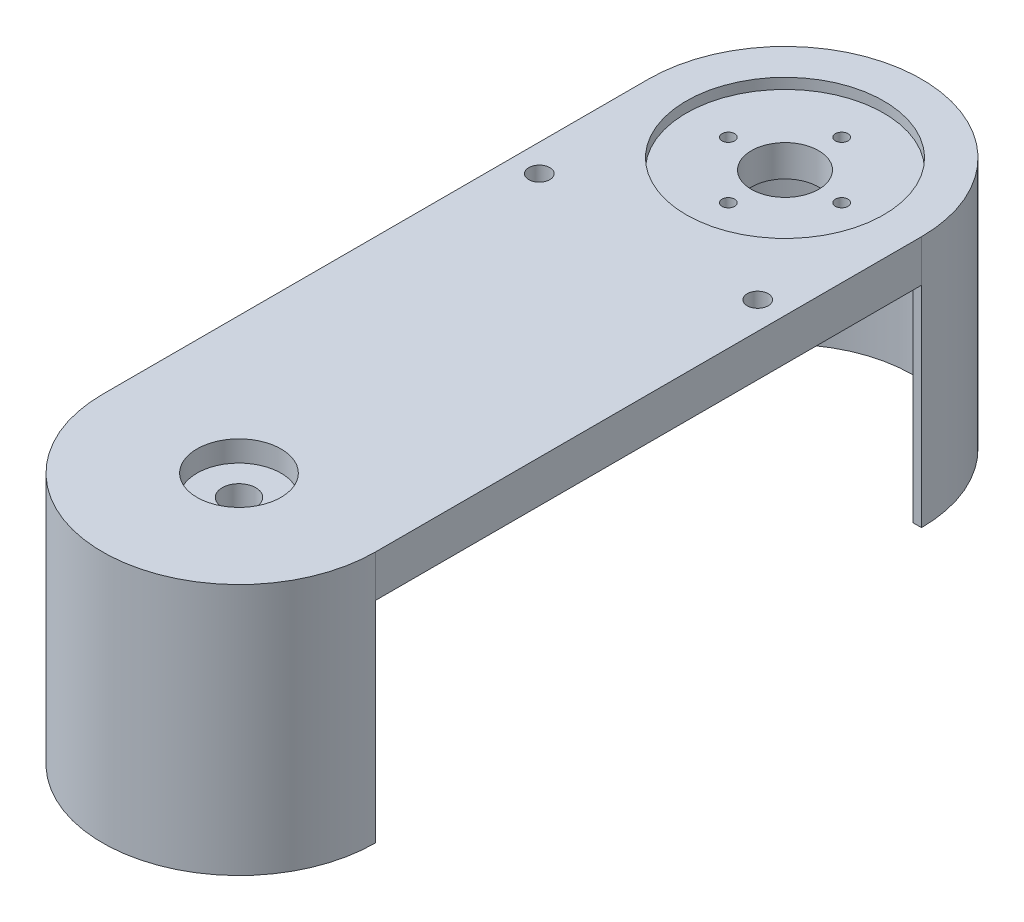
ISO-10303-21;
HEADER;
FILE_DESCRIPTION(('STEP AP214'),'2;1');
FILE_NAME('part.step','',(''),(''),'','','');
FILE_SCHEMA(('AUTOMOTIVE_DESIGN { 1 0 10303 214 1 1 1 1 }'));
ENDSEC;
DATA;
#1=APPLICATION_CONTEXT('core data for automotive mechanical design processes');
#2=APPLICATION_PROTOCOL_DEFINITION('international standard','automotive_design',2000,#1);
#3=PRODUCT_CONTEXT('',#1,'mechanical');
#4=PRODUCT('Part','Part','',(#3));
#5=PRODUCT_RELATED_PRODUCT_CATEGORY('part','',(#4));
#6=PRODUCT_DEFINITION_FORMATION('','',#4);
#7=PRODUCT_DEFINITION_CONTEXT('part definition',#1,'design');
#8=PRODUCT_DEFINITION('design','',#6,#7);
#9=PRODUCT_DEFINITION_SHAPE('','',#8);
#10=(LENGTH_UNIT() NAMED_UNIT(*) SI_UNIT(.MILLI.,.METRE.));
#11=(NAMED_UNIT(*) PLANE_ANGLE_UNIT() SI_UNIT($,.RADIAN.));
#12=(NAMED_UNIT(*) SI_UNIT($,.STERADIAN.) SOLID_ANGLE_UNIT());
#13=UNCERTAINTY_MEASURE_WITH_UNIT(LENGTH_MEASURE(1.E-05),#10,'distance_accuracy_value','');
#14=(GEOMETRIC_REPRESENTATION_CONTEXT(3) GLOBAL_UNCERTAINTY_ASSIGNED_CONTEXT((#13)) GLOBAL_UNIT_ASSIGNED_CONTEXT((#10,
#11,#12)) REPRESENTATION_CONTEXT('',''));
#15=CARTESIAN_POINT('',(0.,0.,0.));
#16=DIRECTION('',(0.,0.,1.));
#17=DIRECTION('',(1.,0.,0.));
#18=AXIS2_PLACEMENT_3D('',#15,#16,#17);
#19=CARTESIAN_POINT('',(0.,-50.,65.));
#20=DIRECTION('',(0.,1.,0.));
#21=DIRECTION('',(0.,0.,1.));
#22=AXIS2_PLACEMENT_3D('',#19,#20,#21);
#23=CYLINDRICAL_SURFACE('',#22,4.);
#24=CARTESIAN_POINT('',(0.,0.,65.));
#25=DIRECTION('',(0.,-1.,0.));
#26=DIRECTION('',(0.,0.,-1.));
#27=AXIS2_PLACEMENT_3D('',#24,#25,#26);
#28=CIRCLE('',#27,4.);
#29=CARTESIAN_POINT('',(0.,0.,69.));
#30=VERTEX_POINT('',#29);
#31=EDGE_CURVE('E305',#30,#30,#28,.T.);
#32=CARTESIAN_POINT('',(0.,5.,65.));
#33=DIRECTION('',(0.,1.,0.));
#34=DIRECTION('',(0.,0.,1.));
#35=AXIS2_PLACEMENT_3D('',#32,#33,#34);
#36=CIRCLE('',#35,4.);
#37=CARTESIAN_POINT('',(0.,5.,69.));
#38=VERTEX_POINT('',#37);
#39=EDGE_CURVE('E45',#38,#38,#36,.F.);
#40=CARTESIAN_POINT('',(0.,0.,69.));
#41=CARTESIAN_POINT('',(0.,0.0520833333333392,69.));
#42=CARTESIAN_POINT('',(0.,0.104166666666671,69.));
#43=CARTESIAN_POINT('',(0.,0.208333333333338,69.));
#44=CARTESIAN_POINT('',(0.,0.260416666666673,69.));
#45=CARTESIAN_POINT('',(0.,0.364583333333339,69.));
#46=CARTESIAN_POINT('',(0.,0.416666666666672,69.));
#47=CARTESIAN_POINT('',(0.,0.520833333333338,69.));
#48=CARTESIAN_POINT('',(0.,0.572916666666673,69.));
#49=CARTESIAN_POINT('',(0.,0.67708333333334,69.));
#50=CARTESIAN_POINT('',(0.,0.729166666666672,69.));
#51=CARTESIAN_POINT('',(0.,0.833333333333339,69.));
#52=CARTESIAN_POINT('',(0.,0.885416666666673,69.));
#53=CARTESIAN_POINT('',(0.,0.98958333333334,69.));
#54=CARTESIAN_POINT('',(0.,1.04166666666667,69.));
#55=CARTESIAN_POINT('',(0.,1.14583333333334,69.));
#56=CARTESIAN_POINT('',(0.,1.19791666666667,69.));
#57=CARTESIAN_POINT('',(0.,1.30208333333334,69.));
#58=CARTESIAN_POINT('',(0.,1.35416666666667,69.));
#59=CARTESIAN_POINT('',(0.,1.45833333333334,69.));
#60=CARTESIAN_POINT('',(0.,1.51041666666667,69.));
#61=CARTESIAN_POINT('',(0.,1.61458333333334,69.));
#62=CARTESIAN_POINT('',(0.,1.66666666666667,69.));
#63=CARTESIAN_POINT('',(0.,1.77083333333334,69.));
#64=CARTESIAN_POINT('',(0.,1.82291666666667,69.));
#65=CARTESIAN_POINT('',(0.,1.92708333333334,69.));
#66=CARTESIAN_POINT('',(0.,1.97916666666667,69.));
#67=CARTESIAN_POINT('',(0.,2.08333333333334,69.));
#68=CARTESIAN_POINT('',(0.,2.13541666666667,69.));
#69=CARTESIAN_POINT('',(0.,2.23958333333334,69.));
#70=CARTESIAN_POINT('',(0.,2.29166666666667,69.));
#71=CARTESIAN_POINT('',(0.,2.39583333333334,69.));
#72=CARTESIAN_POINT('',(0.,2.44791666666667,69.));
#73=CARTESIAN_POINT('',(0.,2.55208333333333,69.));
#74=CARTESIAN_POINT('',(0.,2.60416666666667,69.));
#75=CARTESIAN_POINT('',(0.,2.70833333333333,69.));
#76=CARTESIAN_POINT('',(0.,2.76041666666667,69.));
#77=CARTESIAN_POINT('',(0.,2.86458333333333,69.));
#78=CARTESIAN_POINT('',(0.,2.91666666666667,69.));
#79=CARTESIAN_POINT('',(0.,3.02083333333333,69.));
#80=CARTESIAN_POINT('',(0.,3.07291666666667,69.));
#81=CARTESIAN_POINT('',(0.,3.17708333333334,69.));
#82=CARTESIAN_POINT('',(0.,3.22916666666667,69.));
#83=CARTESIAN_POINT('',(0.,3.33333333333333,69.));
#84=CARTESIAN_POINT('',(0.,3.38541666666667,69.));
#85=CARTESIAN_POINT('',(0.,3.48958333333334,69.));
#86=CARTESIAN_POINT('',(0.,3.54166666666667,69.));
#87=CARTESIAN_POINT('',(0.,3.64583333333333,69.));
#88=CARTESIAN_POINT('',(0.,3.69791666666666,69.));
#89=CARTESIAN_POINT('',(0.,3.80208333333333,69.));
#90=CARTESIAN_POINT('',(0.,3.85416666666667,69.));
#91=CARTESIAN_POINT('',(0.,3.95833333333333,69.));
#92=CARTESIAN_POINT('',(0.,4.01041666666666,69.));
#93=CARTESIAN_POINT('',(0.,4.11458333333333,69.));
#94=CARTESIAN_POINT('',(0.,4.16666666666667,69.));
#95=CARTESIAN_POINT('',(0.,4.27083333333333,69.));
#96=CARTESIAN_POINT('',(0.,4.32291666666667,69.));
#97=CARTESIAN_POINT('',(0.,4.42708333333333,69.));
#98=CARTESIAN_POINT('',(0.,4.47916666666667,69.));
#99=CARTESIAN_POINT('',(0.,4.58333333333333,69.));
#100=CARTESIAN_POINT('',(0.,4.63541666666667,69.));
#101=CARTESIAN_POINT('',(0.,4.73958333333333,69.));
#102=CARTESIAN_POINT('',(0.,4.79166666666667,69.));
#103=CARTESIAN_POINT('',(0.,4.89583333333333,69.));
#104=CARTESIAN_POINT('',(0.,4.94791666666667,69.));
#105=CARTESIAN_POINT('',(0.,5.,69.));
#106=B_SPLINE_CURVE_WITH_KNOTS('',3,(#40,#41,#42,#43,#44,#45,#46,#47,#48,#49,#50,#51,#52,#53,
#54,#55,#56,#57,#58,#59,#60,#61,#62,#63,#64,#65,#66,#67,#68,#69,#70,#71,#72,#73,#74,#75,#76,#77,
#78,#79,#80,#81,#82,#83,#84,#85,#86,#87,#88,#89,#90,#91,#92,#93,#94,#95,#96,#97,#98,#99,#100,
#101,#102,#103,#104,#105),.UNSPECIFIED.,.F.,.F.,(4,2,2,2,2,2,2,2,2,2,2,2,2,2,2,2,2,2,2,2,2,2,2,
2,2,2,2,2,2,2,2,2,4),(0.,0.156249999999997,0.3125,0.468749999999997,0.625000000000001,
0.781249999999997,0.937500000000001,1.09375,1.25,1.40625,1.56249999999999,1.71875,
1.87499999999999,2.03125,2.1875,2.34375,2.5,2.65624999999999,2.8125,2.96874999999999,3.125,
3.28124999999999,3.4375,3.59374999999999,3.74999999999999,3.90624999999999,4.06249999999999,
4.21874999999999,4.37499999999999,4.53124999999999,4.68749999999999,4.84374999999999,
4.99999999999999),.UNSPECIFIED.);
#107=EDGE_CURVE('BSEAM41',#30,#38,#106,.T.);
#108=ORIENTED_EDGE('',*,*,#31,.T.);
#109=ORIENTED_EDGE('',*,*,#39,.F.);
#110=ORIENTED_EDGE('',*,*,#107,.T.);
#111=ORIENTED_EDGE('',*,*,#107,.F.);
#112=EDGE_LOOP('',(#108,#110,#109,#111));
#113=FACE_BOUND('',#112,.T.);
#114=ADVANCED_FACE('F41',(#113),#23,.F.);
#115=CARTESIAN_POINT('',(0.,0.,-65.0000000000001));
#116=DIRECTION('',(0.,-1.,0.));
#117=DIRECTION('',(0.,0.,-1.));
#118=AXIS2_PLACEMENT_3D('',#115,#116,#117);
#119=PLANE('',#118);
#120=CARTESIAN_POINT('',(-26.,0.,-32.5000000000001));
#121=DIRECTION('',(0.,-1.,0.));
#122=DIRECTION('',(0.,0.,-1.));
#123=AXIS2_PLACEMENT_3D('',#120,#121,#122);
#124=CIRCLE('',#123,2.5);
#125=CARTESIAN_POINT('',(-26.,0.,-30.0000000000001));
#126=VERTEX_POINT('',#125);
#127=EDGE_CURVE('E324',#126,#126,#124,.T.);
#128=ORIENTED_EDGE('',*,*,#127,.F.);
#129=EDGE_LOOP('',(#128));
#130=FACE_BOUND('',#129,.T.);
#131=CARTESIAN_POINT('',(26.,0.,-32.5000000000001));
#132=DIRECTION('',(0.,-1.,0.));
#133=DIRECTION('',(0.,0.,-1.));
#134=AXIS2_PLACEMENT_3D('',#131,#132,#133);
#135=CIRCLE('',#134,2.5);
#136=CARTESIAN_POINT('',(26.,0.,-30.0000000000001));
#137=VERTEX_POINT('',#136);
#138=EDGE_CURVE('E331',#137,#137,#135,.T.);
#139=ORIENTED_EDGE('',*,*,#138,.F.);
#140=EDGE_LOOP('',(#139));
#141=FACE_BOUND('',#140,.T.);
#142=ORIENTED_EDGE('',*,*,#31,.F.);
#143=EDGE_LOOP('',(#142));
#144=FACE_BOUND('',#143,.T.);
#145=CARTESIAN_POINT('',(13.5,0.,-65.0000000000001));
#146=DIRECTION('',(0.,-1.,0.));
#147=DIRECTION('',(0.,0.,-1.));
#148=AXIS2_PLACEMENT_3D('',#145,#146,#147);
#149=CIRCLE('',#148,1.5);
#150=CARTESIAN_POINT('',(13.5,0.,-66.5000000000001));
#151=VERTEX_POINT('',#150);
#152=EDGE_CURVE('E269',#151,#151,#149,.T.);
#153=ORIENTED_EDGE('',*,*,#152,.F.);
#154=EDGE_LOOP('',(#153));
#155=FACE_BOUND('',#154,.T.);
#156=CARTESIAN_POINT('',(0.,0.,-78.5000000000001));
#157=DIRECTION('',(0.,-1.,0.));
#158=DIRECTION('',(0.,0.,-1.));
#159=AXIS2_PLACEMENT_3D('',#156,#157,#158);
#160=CIRCLE('',#159,1.5);
#161=CARTESIAN_POINT('',(0.,0.,-80.0000000000001));
#162=VERTEX_POINT('',#161);
#163=EDGE_CURVE('E275',#162,#162,#160,.T.);
#164=ORIENTED_EDGE('',*,*,#163,.F.);
#165=EDGE_LOOP('',(#164));
#166=FACE_BOUND('',#165,.T.);
#167=CARTESIAN_POINT('',(-13.5,0.,-65.0000000000001));
#168=DIRECTION('',(0.,-1.,0.));
#169=DIRECTION('',(0.,0.,-1.));
#170=AXIS2_PLACEMENT_3D('',#167,#168,#169);
#171=CIRCLE('',#170,1.5);
#172=CARTESIAN_POINT('',(-13.5,0.,-66.5000000000001));
#173=VERTEX_POINT('',#172);
#174=EDGE_CURVE('E291',#173,#173,#171,.T.);
#175=ORIENTED_EDGE('',*,*,#174,.F.);
#176=EDGE_LOOP('',(#175));
#177=FACE_BOUND('',#176,.T.);
#178=CARTESIAN_POINT('',(0.,0.,-51.5000000000001));
#179=DIRECTION('',(0.,-1.,0.));
#180=DIRECTION('',(0.,0.,-1.));
#181=AXIS2_PLACEMENT_3D('',#178,#179,#180);
#182=CIRCLE('',#181,1.5);
#183=CARTESIAN_POINT('',(0.,0.,-53.0000000000001));
#184=VERTEX_POINT('',#183);
#185=EDGE_CURVE('E295',#184,#184,#182,.T.);
#186=ORIENTED_EDGE('',*,*,#185,.F.);
#187=EDGE_LOOP('',(#186));
#188=FACE_BOUND('',#187,.T.);
#189=CARTESIAN_POINT('',(0.,0.,-65.0000000000001));
#190=DIRECTION('',(0.,1.,0.));
#191=DIRECTION('',(0.,0.,1.));
#192=AXIS2_PLACEMENT_3D('',#189,#190,#191);
#193=CIRCLE('',#192,8.);
#194=CARTESIAN_POINT('',(0.,0.,-57.0000000000001));
#195=VERTEX_POINT('',#194);
#196=EDGE_CURVE('E192',#195,#195,#193,.T.);
#197=ORIENTED_EDGE('',*,*,#196,.T.);
#198=EDGE_LOOP('',(#197));
#199=FACE_BOUND('',#198,.T.);
#200=CARTESIAN_POINT('',(0.,0.,65.));
#201=DIRECTION('',(0.,1.,0.));
#202=DIRECTION('',(0.,0.,-1.));
#203=AXIS2_PLACEMENT_3D('',#200,#201,#202);
#204=CIRCLE('',#203,30.5);
#205=CARTESIAN_POINT('',(-30.5,0.,65.));
#206=VERTEX_POINT('',#205);
#207=CARTESIAN_POINT('',(30.5,0.,65.));
#208=VERTEX_POINT('',#207);
#209=EDGE_CURVE('E267',#206,#208,#204,.T.);
#210=ORIENTED_EDGE('',*,*,#209,.F.);
#211=DIRECTION('',(1.,0.,0.));
#212=VECTOR('',#211,1.);
#213=CARTESIAN_POINT('',(-30.5,0.,65.));
#214=LINE('',#213,#212);
#215=CARTESIAN_POINT('',(-32.5,0.,65.));
#216=VERTEX_POINT('',#215);
#217=EDGE_CURVE('E266',#216,#206,#214,.T.);
#218=ORIENTED_EDGE('',*,*,#217,.F.);
#219=DIRECTION('',(0.,0.,1.));
#220=VECTOR('',#219,1.);
#221=CARTESIAN_POINT('',(-32.5,0.,-65.0000000000001));
#222=LINE('',#221,#220);
#223=CARTESIAN_POINT('',(-32.5,0.,-65.0000000000001));
#224=VERTEX_POINT('',#223);
#225=EDGE_CURVE('E204',#224,#216,#222,.T.);
#226=ORIENTED_EDGE('',*,*,#225,.F.);
#227=DIRECTION('',(-1.,0.,0.));
#228=VECTOR('',#227,1.);
#229=CARTESIAN_POINT('',(-32.5,0.,-65.0000000000001));
#230=LINE('',#229,#228);
#231=CARTESIAN_POINT('',(-30.5,0.,-65.0000000000001));
#232=VERTEX_POINT('',#231);
#233=EDGE_CURVE('E66',#232,#224,#230,.T.);
#234=ORIENTED_EDGE('',*,*,#233,.F.);
#235=CARTESIAN_POINT('',(0.,0.,-65.0000000000001));
#236=DIRECTION('',(0.,1.,0.));
#237=DIRECTION('',(0.,0.,-1.));
#238=AXIS2_PLACEMENT_3D('',#235,#236,#237);
#239=CIRCLE('',#238,30.5);
#240=CARTESIAN_POINT('',(30.5,0.,-65.0000000000001));
#241=VERTEX_POINT('',#240);
#242=EDGE_CURVE('E153',#241,#232,#239,.T.);
#243=ORIENTED_EDGE('',*,*,#242,.F.);
#244=DIRECTION('',(-1.,0.,0.));
#245=VECTOR('',#244,1.);
#246=CARTESIAN_POINT('',(30.5,0.,-65.0000000000001));
#247=LINE('',#246,#245);
#248=CARTESIAN_POINT('',(32.5,0.,-65.0000000000001));
#249=VERTEX_POINT('',#248);
#250=EDGE_CURVE('E148',#249,#241,#247,.T.);
#251=ORIENTED_EDGE('',*,*,#250,.F.);
#252=DIRECTION('',(0.,0.,-1.));
#253=VECTOR('',#252,1.);
#254=CARTESIAN_POINT('',(32.5,0.,-65.0000000000001));
#255=LINE('',#254,#253);
#256=CARTESIAN_POINT('',(32.5,0.,65.));
#257=VERTEX_POINT('',#256);
#258=EDGE_CURVE('E213',#257,#249,#255,.T.);
#259=ORIENTED_EDGE('',*,*,#258,.F.);
#260=DIRECTION('',(1.,0.,0.));
#261=VECTOR('',#260,1.);
#262=CARTESIAN_POINT('',(30.5,0.,65.));
#263=LINE('',#262,#261);
#264=EDGE_CURVE('E141',#208,#257,#263,.T.);
#265=ORIENTED_EDGE('',*,*,#264,.F.);
#266=EDGE_LOOP('',(#210,#218,#226,#234,#243,#251,#259,#265));
#267=FACE_BOUND('',#266,.T.);
#268=ADVANCED_FACE('F245',(#130,#141,#144,#155,#166,#177,#188,#199,#267),#119,.T.);
#269=CARTESIAN_POINT('',(0.,10.,-65.0000000000001));
#270=DIRECTION('',(0.,-1.,0.));
#271=DIRECTION('',(0.,0.,-1.));
#272=AXIS2_PLACEMENT_3D('',#269,#270,#271);
#273=CYLINDRICAL_SURFACE('',#272,32.5);
#274=DIRECTION('',(0.,-1.,0.));
#275=VECTOR('',#274,1.);
#276=CARTESIAN_POINT('',(32.5,10.,-65.0000000000001));
#277=LINE('',#276,#275);
#278=CARTESIAN_POINT('',(32.5,10.,-65.0000000000001));
#279=VERTEX_POINT('',#278);
#280=EDGE_CURVE('E222',#279,#249,#277,.T.);
#281=ORIENTED_EDGE('',*,*,#280,.T.);
#282=DIRECTION('',(0.,1.,0.));
#283=VECTOR('',#282,1.);
#284=CARTESIAN_POINT('',(32.5,-50.,-65.0000000000001));
#285=LINE('',#284,#283);
#286=CARTESIAN_POINT('',(32.5,-50.,-65.0000000000001));
#287=VERTEX_POINT('',#286);
#288=EDGE_CURVE('E187',#287,#249,#285,.T.);
#289=ORIENTED_EDGE('',*,*,#288,.F.);
#290=CARTESIAN_POINT('',(0.,-50.,-65.0000000000001));
#291=DIRECTION('',(0.,-1.,0.));
#292=DIRECTION('',(0.,0.,-1.));
#293=AXIS2_PLACEMENT_3D('',#290,#291,#292);
#294=CIRCLE('',#293,32.5);
#295=CARTESIAN_POINT('',(-32.5,-50.,-65.0000000000001));
#296=VERTEX_POINT('',#295);
#297=EDGE_CURVE('E158',#296,#287,#294,.T.);
#298=ORIENTED_EDGE('',*,*,#297,.F.);
#299=DIRECTION('',(0.,1.,0.));
#300=VECTOR('',#299,1.);
#301=CARTESIAN_POINT('',(-32.5,-50.,-65.0000000000001));
#302=LINE('',#301,#300);
#303=EDGE_CURVE('E170',#296,#224,#302,.T.);
#304=ORIENTED_EDGE('',*,*,#303,.T.);
#305=DIRECTION('',(0.,-1.,0.));
#306=VECTOR('',#305,1.);
#307=CARTESIAN_POINT('',(-32.5,10.,-65.0000000000001));
#308=LINE('',#307,#306);
#309=CARTESIAN_POINT('',(-32.5,10.,-65.0000000000001));
#310=VERTEX_POINT('',#309);
#311=EDGE_CURVE('E11',#310,#224,#308,.T.);
#312=ORIENTED_EDGE('',*,*,#311,.F.);
#313=CARTESIAN_POINT('',(0.,10.,-65.0000000000001));
#314=DIRECTION('',(0.,1.,0.));
#315=DIRECTION('',(0.,0.,-1.));
#316=AXIS2_PLACEMENT_3D('',#313,#314,#315);
#317=CIRCLE('',#316,32.5);
#318=EDGE_CURVE('E208',#279,#310,#317,.T.);
#319=ORIENTED_EDGE('',*,*,#318,.F.);
#320=EDGE_LOOP('',(#281,#289,#298,#304,#312,#319));
#321=FACE_BOUND('',#320,.T.);
#322=ADVANCED_FACE('F43',(#321),#273,.T.);
#323=CARTESIAN_POINT('',(-32.5,10.,-65.0000000000001));
#324=DIRECTION('',(1.,0.,0.));
#325=DIRECTION('',(0.,0.,-1.));
#326=AXIS2_PLACEMENT_3D('',#323,#324,#325);
#327=PLANE('',#326);
#328=ORIENTED_EDGE('',*,*,#225,.T.);
#329=DIRECTION('',(0.,-1.,0.));
#330=VECTOR('',#329,1.);
#331=CARTESIAN_POINT('',(-32.5,10.,65.));
#332=LINE('',#331,#330);
#333=CARTESIAN_POINT('',(-32.5,10.,65.));
#334=VERTEX_POINT('',#333);
#335=EDGE_CURVE('E51',#334,#216,#332,.T.);
#336=ORIENTED_EDGE('',*,*,#335,.F.);
#337=DIRECTION('',(0.,0.,1.));
#338=VECTOR('',#337,1.);
#339=CARTESIAN_POINT('',(-32.5,10.,-65.0000000000001));
#340=LINE('',#339,#338);
#341=EDGE_CURVE('E212',#310,#334,#340,.T.);
#342=ORIENTED_EDGE('',*,*,#341,.F.);
#343=ORIENTED_EDGE('',*,*,#311,.T.);
#344=EDGE_LOOP('',(#328,#336,#342,#343));
#345=FACE_BOUND('',#344,.T.);
#346=ADVANCED_FACE('F265',(#345),#327,.F.);
#347=CARTESIAN_POINT('',(0.,10.,65.));
#348=DIRECTION('',(0.,-1.,0.));
#349=DIRECTION('',(0.,0.,-1.));
#350=AXIS2_PLACEMENT_3D('',#347,#348,#349);
#351=CYLINDRICAL_SURFACE('',#350,32.5);
#352=ORIENTED_EDGE('',*,*,#335,.T.);
#353=DIRECTION('',(0.,1.,0.));
#354=VECTOR('',#353,1.);
#355=CARTESIAN_POINT('',(-32.5,-50.,65.));
#356=LINE('',#355,#354);
#357=CARTESIAN_POINT('',(-32.5,-50.,65.));
#358=VERTEX_POINT('',#357);
#359=EDGE_CURVE('E124',#358,#216,#356,.T.);
#360=ORIENTED_EDGE('',*,*,#359,.F.);
#361=CARTESIAN_POINT('',(0.,-50.,65.));
#362=DIRECTION('',(0.,-1.,0.));
#363=DIRECTION('',(0.,0.,-1.));
#364=AXIS2_PLACEMENT_3D('',#361,#362,#363);
#365=CIRCLE('',#364,32.5);
#366=CARTESIAN_POINT('',(32.5,-50.,65.));
#367=VERTEX_POINT('',#366);
#368=EDGE_CURVE('E132',#367,#358,#365,.T.);
#369=ORIENTED_EDGE('',*,*,#368,.F.);
#370=DIRECTION('',(0.,1.,0.));
#371=VECTOR('',#370,1.);
#372=CARTESIAN_POINT('',(32.5,-50.,65.));
#373=LINE('',#372,#371);
#374=EDGE_CURVE('E282',#367,#257,#373,.T.);
#375=ORIENTED_EDGE('',*,*,#374,.T.);
#376=DIRECTION('',(0.,-1.,0.));
#377=VECTOR('',#376,1.);
#378=CARTESIAN_POINT('',(32.5,10.,65.));
#379=LINE('',#378,#377);
#380=CARTESIAN_POINT('',(32.5,10.,65.));
#381=VERTEX_POINT('',#380);
#382=EDGE_CURVE('E232',#381,#257,#379,.T.);
#383=ORIENTED_EDGE('',*,*,#382,.F.);
#384=CARTESIAN_POINT('',(0.,10.,65.));
#385=DIRECTION('',(0.,1.,0.));
#386=DIRECTION('',(0.,0.,-1.));
#387=AXIS2_PLACEMENT_3D('',#384,#385,#386);
#388=CIRCLE('',#387,32.5);
#389=EDGE_CURVE('E216',#334,#381,#388,.T.);
#390=ORIENTED_EDGE('',*,*,#389,.F.);
#391=EDGE_LOOP('',(#352,#360,#369,#375,#383,#390));
#392=FACE_BOUND('',#391,.T.);
#393=ADVANCED_FACE('F144',(#392),#351,.T.);
#394=CARTESIAN_POINT('',(32.5,10.,-65.0000000000001));
#395=DIRECTION('',(-1.,0.,0.));
#396=DIRECTION('',(0.,0.,1.));
#397=AXIS2_PLACEMENT_3D('',#394,#395,#396);
#398=PLANE('',#397);
#399=ORIENTED_EDGE('',*,*,#258,.T.);
#400=ORIENTED_EDGE('',*,*,#280,.F.);
#401=DIRECTION('',(0.,0.,-1.));
#402=VECTOR('',#401,1.);
#403=CARTESIAN_POINT('',(32.5,10.,-65.0000000000001));
#404=LINE('',#403,#402);
#405=EDGE_CURVE('E219',#381,#279,#404,.T.);
#406=ORIENTED_EDGE('',*,*,#405,.F.);
#407=ORIENTED_EDGE('',*,*,#382,.T.);
#408=EDGE_LOOP('',(#399,#400,#406,#407));
#409=FACE_BOUND('',#408,.T.);
#410=ADVANCED_FACE('F241',(#409),#398,.F.);
#411=CARTESIAN_POINT('',(0.,10.,-65.0000000000001));
#412=DIRECTION('',(0.,-1.,0.));
#413=DIRECTION('',(0.,0.,-1.));
#414=AXIS2_PLACEMENT_3D('',#411,#412,#413);
#415=PLANE('',#414);
#416=CARTESIAN_POINT('',(-26.,10.,-32.5000000000001));
#417=DIRECTION('',(0.,1.,0.));
#418=DIRECTION('',(0.,0.,1.));
#419=AXIS2_PLACEMENT_3D('',#416,#417,#418);
#420=CIRCLE('',#419,2.5);
#421=CARTESIAN_POINT('',(-26.,10.,-30.0000000000001));
#422=VERTEX_POINT('',#421);
#423=EDGE_CURVE('E335',#422,#422,#420,.T.);
#424=ORIENTED_EDGE('',*,*,#423,.F.);
#425=EDGE_LOOP('',(#424));
#426=FACE_BOUND('',#425,.T.);
#427=CARTESIAN_POINT('',(26.,10.,-32.5000000000001));
#428=DIRECTION('',(0.,1.,0.));
#429=DIRECTION('',(0.,0.,1.));
#430=AXIS2_PLACEMENT_3D('',#427,#428,#429);
#431=CIRCLE('',#430,2.5);
#432=CARTESIAN_POINT('',(26.,10.,-30.0000000000001));
#433=VERTEX_POINT('',#432);
#434=EDGE_CURVE('E336',#433,#433,#431,.T.);
#435=ORIENTED_EDGE('',*,*,#434,.F.);
#436=EDGE_LOOP('',(#435));
#437=FACE_BOUND('',#436,.T.);
#438=CARTESIAN_POINT('',(0.,10.,65.));
#439=DIRECTION('',(0.,1.,0.));
#440=DIRECTION('',(0.,0.,1.));
#441=AXIS2_PLACEMENT_3D('',#438,#439,#440);
#442=CIRCLE('',#441,10.);
#443=CARTESIAN_POINT('',(0.,10.,75.));
#444=VERTEX_POINT('',#443);
#445=EDGE_CURVE('E319',#444,#444,#442,.T.);
#446=ORIENTED_EDGE('',*,*,#445,.F.);
#447=EDGE_LOOP('',(#446));
#448=FACE_BOUND('',#447,.T.);
#449=CARTESIAN_POINT('',(0.,10.,-65.0000000000001));
#450=DIRECTION('',(0.,1.,0.));
#451=DIRECTION('',(0.,0.,1.));
#452=AXIS2_PLACEMENT_3D('',#449,#450,#451);
#453=CIRCLE('',#452,23.5);
#454=CARTESIAN_POINT('',(0.,10.,-41.5000000000001));
#455=VERTEX_POINT('',#454);
#456=EDGE_CURVE('E196',#455,#455,#453,.T.);
#457=ORIENTED_EDGE('',*,*,#456,.F.);
#458=EDGE_LOOP('',(#457));
#459=FACE_BOUND('',#458,.T.);
#460=ORIENTED_EDGE('',*,*,#318,.T.);
#461=ORIENTED_EDGE('',*,*,#341,.T.);
#462=ORIENTED_EDGE('',*,*,#389,.T.);
#463=ORIENTED_EDGE('',*,*,#405,.T.);
#464=EDGE_LOOP('',(#460,#461,#462,#463));
#465=FACE_BOUND('',#464,.T.);
#466=ADVANCED_FACE('F263',(#426,#437,#448,#459,#465),#415,.F.);
#467=CARTESIAN_POINT('',(0.,7.5,-65.0000000000001));
#468=DIRECTION('',(0.,1.,0.));
#469=DIRECTION('',(0.,0.,1.));
#470=AXIS2_PLACEMENT_3D('',#467,#468,#469);
#471=CYLINDRICAL_SURFACE('',#470,23.5);
#472=CARTESIAN_POINT('',(0.,7.5,-65.0000000000001));
#473=DIRECTION('',(0.,1.,0.));
#474=DIRECTION('',(0.,0.,1.));
#475=AXIS2_PLACEMENT_3D('',#472,#473,#474);
#476=CIRCLE('',#475,23.5);
#477=CARTESIAN_POINT('',(0.,7.5,-41.5000000000001));
#478=VERTEX_POINT('',#477);
#479=EDGE_CURVE('E200',#478,#478,#476,.T.);
#480=ORIENTED_EDGE('',*,*,#479,.F.);
#481=EDGE_LOOP('',(#480));
#482=FACE_BOUND('',#481,.T.);
#483=ORIENTED_EDGE('',*,*,#456,.T.);
#484=EDGE_LOOP('',(#483));
#485=FACE_BOUND('',#484,.T.);
#486=ADVANCED_FACE('F348',(#482,#485),#471,.F.);
#487=CARTESIAN_POINT('',(0.,7.5,-65.0000000000001));
#488=DIRECTION('',(0.,1.,0.));
#489=DIRECTION('',(0.,0.,1.));
#490=AXIS2_PLACEMENT_3D('',#487,#488,#489);
#491=PLANE('',#490);
#492=CARTESIAN_POINT('',(13.5,7.5,-65.0000000000001));
#493=DIRECTION('',(0.,1.,0.));
#494=DIRECTION('',(0.,0.,1.));
#495=AXIS2_PLACEMENT_3D('',#492,#493,#494);
#496=CIRCLE('',#495,1.5);
#497=CARTESIAN_POINT('',(13.5,7.5,-63.5000000000001));
#498=VERTEX_POINT('',#497);
#499=EDGE_CURVE('E299',#498,#498,#496,.T.);
#500=ORIENTED_EDGE('',*,*,#499,.F.);
#501=EDGE_LOOP('',(#500));
#502=FACE_BOUND('',#501,.T.);
#503=CARTESIAN_POINT('',(0.,7.5,-78.5000000000001));
#504=DIRECTION('',(0.,1.,0.));
#505=DIRECTION('',(0.,0.,1.));
#506=AXIS2_PLACEMENT_3D('',#503,#504,#505);
#507=CIRCLE('',#506,1.5);
#508=CARTESIAN_POINT('',(0.,7.5,-77.0000000000001));
#509=VERTEX_POINT('',#508);
#510=EDGE_CURVE('E309',#509,#509,#507,.T.);
#511=ORIENTED_EDGE('',*,*,#510,.F.);
#512=EDGE_LOOP('',(#511));
#513=FACE_BOUND('',#512,.T.);
#514=CARTESIAN_POINT('',(-13.5,7.5,-65.0000000000001));
#515=DIRECTION('',(0.,1.,0.));
#516=DIRECTION('',(0.,0.,1.));
#517=AXIS2_PLACEMENT_3D('',#514,#515,#516);
#518=CIRCLE('',#517,1.5);
#519=CARTESIAN_POINT('',(-13.5,7.5,-63.5000000000001));
#520=VERTEX_POINT('',#519);
#521=EDGE_CURVE('E304',#520,#520,#518,.T.);
#522=ORIENTED_EDGE('',*,*,#521,.F.);
#523=EDGE_LOOP('',(#522));
#524=FACE_BOUND('',#523,.T.);
#525=CARTESIAN_POINT('',(0.,7.5,-51.5000000000001));
#526=DIRECTION('',(0.,1.,0.));
#527=DIRECTION('',(0.,0.,1.));
#528=AXIS2_PLACEMENT_3D('',#525,#526,#527);
#529=CIRCLE('',#528,1.5);
#530=CARTESIAN_POINT('',(0.,7.5,-50.0000000000001));
#531=VERTEX_POINT('',#530);
#532=EDGE_CURVE('E300',#531,#531,#529,.T.);
#533=ORIENTED_EDGE('',*,*,#532,.F.);
#534=EDGE_LOOP('',(#533));
#535=FACE_BOUND('',#534,.T.);
#536=CARTESIAN_POINT('',(0.,7.5,-65.0000000000001));
#537=DIRECTION('',(0.,1.,0.));
#538=DIRECTION('',(0.,0.,1.));
#539=AXIS2_PLACEMENT_3D('',#536,#537,#538);
#540=CIRCLE('',#539,8.);
#541=CARTESIAN_POINT('',(0.,7.5,-57.0000000000001));
#542=VERTEX_POINT('',#541);
#543=EDGE_CURVE('E191',#542,#542,#540,.T.);
#544=ORIENTED_EDGE('',*,*,#543,.F.);
#545=EDGE_LOOP('',(#544));
#546=FACE_BOUND('',#545,.T.);
#547=ORIENTED_EDGE('',*,*,#479,.T.);
#548=EDGE_LOOP('',(#547));
#549=FACE_BOUND('',#548,.T.);
#550=ADVANCED_FACE('F357',(#502,#513,#524,#535,#546,#549),#491,.T.);
#551=CARTESIAN_POINT('',(0.,0.,-65.0000000000001));
#552=DIRECTION('',(0.,1.,0.));
#553=DIRECTION('',(0.,0.,1.));
#554=AXIS2_PLACEMENT_3D('',#551,#552,#553);
#555=CYLINDRICAL_SURFACE('',#554,8.);
#556=ORIENTED_EDGE('',*,*,#196,.F.);
#557=EDGE_LOOP('',(#556));
#558=FACE_BOUND('',#557,.T.);
#559=ORIENTED_EDGE('',*,*,#543,.T.);
#560=EDGE_LOOP('',(#559));
#561=FACE_BOUND('',#560,.T.);
#562=ADVANCED_FACE('F363',(#558,#561),#555,.F.);
#563=CARTESIAN_POINT('',(30.5,-50.,-65.0000000000001));
#564=DIRECTION('',(0.,0.,-1.));
#565=DIRECTION('',(-1.,0.,0.));
#566=AXIS2_PLACEMENT_3D('',#563,#564,#565);
#567=PLANE('',#566);
#568=ORIENTED_EDGE('',*,*,#250,.T.);
#569=DIRECTION('',(0.,1.,0.));
#570=VECTOR('',#569,1.);
#571=CARTESIAN_POINT('',(30.5,-50.,-65.0000000000001));
#572=LINE('',#571,#570);
#573=CARTESIAN_POINT('',(30.5,-50.,-65.0000000000001));
#574=VERTEX_POINT('',#573);
#575=EDGE_CURVE('E183',#574,#241,#572,.T.);
#576=ORIENTED_EDGE('',*,*,#575,.F.);
#577=DIRECTION('',(-1.,0.,0.));
#578=VECTOR('',#577,1.);
#579=CARTESIAN_POINT('',(30.5,-50.,-65.0000000000001));
#580=LINE('',#579,#578);
#581=EDGE_CURVE('E162',#287,#574,#580,.T.);
#582=ORIENTED_EDGE('',*,*,#581,.F.);
#583=ORIENTED_EDGE('',*,*,#288,.T.);
#584=EDGE_LOOP('',(#568,#576,#582,#583));
#585=FACE_BOUND('',#584,.T.);
#586=ADVANCED_FACE('F248',(#585),#567,.F.);
#587=CARTESIAN_POINT('',(0.,-50.,-65.0000000000001));
#588=DIRECTION('',(0.,1.,0.));
#589=DIRECTION('',(0.,0.,1.));
#590=AXIS2_PLACEMENT_3D('',#587,#588,#589);
#591=CYLINDRICAL_SURFACE('',#590,30.5);
#592=ORIENTED_EDGE('',*,*,#242,.T.);
#593=DIRECTION('',(0.,1.,0.));
#594=VECTOR('',#593,1.);
#595=CARTESIAN_POINT('',(-30.5,-50.,-65.0000000000001));
#596=LINE('',#595,#594);
#597=CARTESIAN_POINT('',(-30.5,-50.,-65.0000000000001));
#598=VERTEX_POINT('',#597);
#599=EDGE_CURVE('E179',#598,#232,#596,.T.);
#600=ORIENTED_EDGE('',*,*,#599,.F.);
#601=CARTESIAN_POINT('',(0.,-50.,-65.0000000000001));
#602=DIRECTION('',(0.,1.,0.));
#603=DIRECTION('',(0.,0.,-1.));
#604=AXIS2_PLACEMENT_3D('',#601,#602,#603);
#605=CIRCLE('',#604,30.5);
#606=EDGE_CURVE('E165',#574,#598,#605,.T.);
#607=ORIENTED_EDGE('',*,*,#606,.F.);
#608=ORIENTED_EDGE('',*,*,#575,.T.);
#609=EDGE_LOOP('',(#592,#600,#607,#608));
#610=FACE_BOUND('',#609,.T.);
#611=ADVANCED_FACE('F252',(#610),#591,.F.);
#612=CARTESIAN_POINT('',(-32.5,-50.,-65.0000000000001));
#613=DIRECTION('',(0.,0.,-1.));
#614=DIRECTION('',(-1.,0.,0.));
#615=AXIS2_PLACEMENT_3D('',#612,#613,#614);
#616=PLANE('',#615);
#617=ORIENTED_EDGE('',*,*,#233,.T.);
#618=ORIENTED_EDGE('',*,*,#303,.F.);
#619=DIRECTION('',(-1.,0.,0.));
#620=VECTOR('',#619,1.);
#621=CARTESIAN_POINT('',(-32.5,-50.,-65.0000000000001));
#622=LINE('',#621,#620);
#623=EDGE_CURVE('E168',#598,#296,#622,.T.);
#624=ORIENTED_EDGE('',*,*,#623,.F.);
#625=ORIENTED_EDGE('',*,*,#599,.T.);
#626=EDGE_LOOP('',(#617,#618,#624,#625));
#627=FACE_BOUND('',#626,.T.);
#628=ADVANCED_FACE('F410',(#627),#616,.F.);
#629=CARTESIAN_POINT('',(0.,-50.,-65.0000000000001));
#630=DIRECTION('',(0.,-1.,0.));
#631=DIRECTION('',(0.,0.,-1.));
#632=AXIS2_PLACEMENT_3D('',#629,#630,#631);
#633=PLANE('',#632);
#634=ORIENTED_EDGE('',*,*,#297,.T.);
#635=ORIENTED_EDGE('',*,*,#581,.T.);
#636=ORIENTED_EDGE('',*,*,#606,.T.);
#637=ORIENTED_EDGE('',*,*,#623,.T.);
#638=EDGE_LOOP('',(#634,#635,#636,#637));
#639=FACE_BOUND('',#638,.T.);
#640=ADVANCED_FACE('F256',(#639),#633,.T.);
#641=CARTESIAN_POINT('',(-30.5,-50.,65.));
#642=DIRECTION('',(0.,0.,1.));
#643=DIRECTION('',(1.,0.,0.));
#644=AXIS2_PLACEMENT_3D('',#641,#642,#643);
#645=PLANE('',#644);
#646=ORIENTED_EDGE('',*,*,#217,.T.);
#647=DIRECTION('',(0.,1.,0.));
#648=VECTOR('',#647,1.);
#649=CARTESIAN_POINT('',(-30.5,-50.,65.));
#650=LINE('',#649,#648);
#651=CARTESIAN_POINT('',(-30.5,-50.,65.));
#652=VERTEX_POINT('',#651);
#653=EDGE_CURVE('E127',#652,#206,#650,.T.);
#654=ORIENTED_EDGE('',*,*,#653,.F.);
#655=DIRECTION('',(1.,0.,0.));
#656=VECTOR('',#655,1.);
#657=CARTESIAN_POINT('',(-30.5,-50.,65.));
#658=LINE('',#657,#656);
#659=EDGE_CURVE('E120',#358,#652,#658,.T.);
#660=ORIENTED_EDGE('',*,*,#659,.F.);
#661=ORIENTED_EDGE('',*,*,#359,.T.);
#662=EDGE_LOOP('',(#646,#654,#660,#661));
#663=FACE_BOUND('',#662,.T.);
#664=ADVANCED_FACE('F122',(#663),#645,.F.);
#665=CARTESIAN_POINT('',(0.,-50.,65.));
#666=DIRECTION('',(0.,1.,0.));
#667=DIRECTION('',(0.,0.,1.));
#668=AXIS2_PLACEMENT_3D('',#665,#666,#667);
#669=CYLINDRICAL_SURFACE('',#668,30.5);
#670=ORIENTED_EDGE('',*,*,#209,.T.);
#671=DIRECTION('',(0.,1.,0.));
#672=VECTOR('',#671,1.);
#673=CARTESIAN_POINT('',(30.5,-50.,65.));
#674=LINE('',#673,#672);
#675=CARTESIAN_POINT('',(30.5,-50.,65.));
#676=VERTEX_POINT('',#675);
#677=EDGE_CURVE('E58',#676,#208,#674,.T.);
#678=ORIENTED_EDGE('',*,*,#677,.F.);
#679=CARTESIAN_POINT('',(0.,-50.,65.));
#680=DIRECTION('',(0.,1.,0.));
#681=DIRECTION('',(0.,0.,-1.));
#682=AXIS2_PLACEMENT_3D('',#679,#680,#681);
#683=CIRCLE('',#682,30.5);
#684=EDGE_CURVE('E131',#652,#676,#683,.T.);
#685=ORIENTED_EDGE('',*,*,#684,.F.);
#686=ORIENTED_EDGE('',*,*,#653,.T.);
#687=EDGE_LOOP('',(#670,#678,#685,#686));
#688=FACE_BOUND('',#687,.T.);
#689=ADVANCED_FACE('F402',(#688),#669,.F.);
#690=CARTESIAN_POINT('',(30.5,-50.,65.));
#691=DIRECTION('',(0.,0.,1.));
#692=DIRECTION('',(1.,0.,0.));
#693=AXIS2_PLACEMENT_3D('',#690,#691,#692);
#694=PLANE('',#693);
#695=ORIENTED_EDGE('',*,*,#264,.T.);
#696=ORIENTED_EDGE('',*,*,#374,.F.);
#697=DIRECTION('',(1.,0.,0.));
#698=VECTOR('',#697,1.);
#699=CARTESIAN_POINT('',(30.5,-50.,65.));
#700=LINE('',#699,#698);
#701=EDGE_CURVE('E136',#676,#367,#700,.T.);
#702=ORIENTED_EDGE('',*,*,#701,.F.);
#703=ORIENTED_EDGE('',*,*,#677,.T.);
#704=EDGE_LOOP('',(#695,#696,#702,#703));
#705=FACE_BOUND('',#704,.T.);
#706=ADVANCED_FACE('F399',(#705),#694,.F.);
#707=CARTESIAN_POINT('',(0.,-50.,65.));
#708=DIRECTION('',(0.,-1.,0.));
#709=DIRECTION('',(0.,0.,-1.));
#710=AXIS2_PLACEMENT_3D('',#707,#708,#709);
#711=PLANE('',#710);
#712=ORIENTED_EDGE('',*,*,#368,.T.);
#713=ORIENTED_EDGE('',*,*,#659,.T.);
#714=ORIENTED_EDGE('',*,*,#684,.T.);
#715=ORIENTED_EDGE('',*,*,#701,.T.);
#716=EDGE_LOOP('',(#712,#713,#714,#715));
#717=FACE_BOUND('',#716,.T.);
#718=ADVANCED_FACE('F135',(#717),#711,.T.);
#719=CARTESIAN_POINT('',(0.,-2.5,-51.5000000000001));
#720=DIRECTION('',(0.,1.,0.));
#721=DIRECTION('',(0.,0.,1.));
#722=AXIS2_PLACEMENT_3D('',#719,#720,#721);
#723=CYLINDRICAL_SURFACE('',#722,1.5);
#724=ORIENTED_EDGE('',*,*,#185,.T.);
#725=EDGE_LOOP('',(#724));
#726=FACE_BOUND('',#725,.T.);
#727=ORIENTED_EDGE('',*,*,#532,.T.);
#728=EDGE_LOOP('',(#727));
#729=FACE_BOUND('',#728,.T.);
#730=ADVANCED_FACE('F392',(#726,#729),#723,.F.);
#731=CARTESIAN_POINT('',(-13.5,-2.5,-65.0000000000001));
#732=DIRECTION('',(0.,1.,0.));
#733=DIRECTION('',(0.,0.,1.));
#734=AXIS2_PLACEMENT_3D('',#731,#732,#733);
#735=CYLINDRICAL_SURFACE('',#734,1.5);
#736=ORIENTED_EDGE('',*,*,#174,.T.);
#737=EDGE_LOOP('',(#736));
#738=FACE_BOUND('',#737,.T.);
#739=ORIENTED_EDGE('',*,*,#521,.T.);
#740=EDGE_LOOP('',(#739));
#741=FACE_BOUND('',#740,.T.);
#742=ADVANCED_FACE('F388',(#738,#741),#735,.F.);
#743=CARTESIAN_POINT('',(0.,-2.5,-78.5000000000001));
#744=DIRECTION('',(0.,1.,0.));
#745=DIRECTION('',(0.,0.,1.));
#746=AXIS2_PLACEMENT_3D('',#743,#744,#745);
#747=CYLINDRICAL_SURFACE('',#746,1.5);
#748=ORIENTED_EDGE('',*,*,#163,.T.);
#749=EDGE_LOOP('',(#748));
#750=FACE_BOUND('',#749,.T.);
#751=ORIENTED_EDGE('',*,*,#510,.T.);
#752=EDGE_LOOP('',(#751));
#753=FACE_BOUND('',#752,.T.);
#754=ADVANCED_FACE('F384',(#750,#753),#747,.F.);
#755=CARTESIAN_POINT('',(13.5,-2.5,-65.0000000000001));
#756=DIRECTION('',(0.,1.,0.));
#757=DIRECTION('',(0.,0.,1.));
#758=AXIS2_PLACEMENT_3D('',#755,#756,#757);
#759=CYLINDRICAL_SURFACE('',#758,1.5);
#760=ORIENTED_EDGE('',*,*,#152,.T.);
#761=EDGE_LOOP('',(#760));
#762=FACE_BOUND('',#761,.T.);
#763=ORIENTED_EDGE('',*,*,#499,.T.);
#764=EDGE_LOOP('',(#763));
#765=FACE_BOUND('',#764,.T.);
#766=ADVANCED_FACE('F380',(#762,#765),#759,.F.);
#767=CARTESIAN_POINT('',(0.,5.,65.));
#768=DIRECTION('',(0.,1.,0.));
#769=DIRECTION('',(0.,0.,1.));
#770=AXIS2_PLACEMENT_3D('',#767,#768,#769);
#771=PLANE('',#770);
#772=CARTESIAN_POINT('',(0.,5.,65.));
#773=DIRECTION('',(0.,1.,0.));
#774=DIRECTION('',(0.,0.,1.));
#775=AXIS2_PLACEMENT_3D('',#772,#773,#774);
#776=CIRCLE('',#775,10.);
#777=CARTESIAN_POINT('',(0.,5.,75.));
#778=VERTEX_POINT('',#777);
#779=EDGE_CURVE('E323',#778,#778,#776,.T.);
#780=ORIENTED_EDGE('',*,*,#779,.T.);
#781=EDGE_LOOP('',(#780));
#782=FACE_BOUND('',#781,.T.);
#783=ORIENTED_EDGE('',*,*,#39,.T.);
#784=EDGE_LOOP('',(#783));
#785=FACE_BOUND('',#784,.T.);
#786=ADVANCED_FACE('F383',(#782,#785),#771,.T.);
#787=CARTESIAN_POINT('',(0.,5.,65.));
#788=DIRECTION('',(0.,1.,0.));
#789=DIRECTION('',(0.,0.,1.));
#790=AXIS2_PLACEMENT_3D('',#787,#788,#789);
#791=CYLINDRICAL_SURFACE('',#790,10.);
#792=ORIENTED_EDGE('',*,*,#779,.F.);
#793=EDGE_LOOP('',(#792));
#794=FACE_BOUND('',#793,.T.);
#795=ORIENTED_EDGE('',*,*,#445,.T.);
#796=EDGE_LOOP('',(#795));
#797=FACE_BOUND('',#796,.T.);
#798=ADVANCED_FACE('F378',(#794,#797),#791,.F.);
#799=CARTESIAN_POINT('',(26.,-50.,-32.5000000000001));
#800=DIRECTION('',(0.,1.,0.));
#801=DIRECTION('',(0.,0.,1.));
#802=AXIS2_PLACEMENT_3D('',#799,#800,#801);
#803=CYLINDRICAL_SURFACE('',#802,2.5);
#804=CARTESIAN_POINT('',(26.,0.,-30.0000000000001));
#805=CARTESIAN_POINT('',(26.,0.104166666666674,-30.0000000000001));
#806=CARTESIAN_POINT('',(26.,0.20833333333334,-30.0000000000001));
#807=CARTESIAN_POINT('',(26.,0.416666666666674,-30.0000000000001));
#808=CARTESIAN_POINT('',(26.,0.520833333333341,-30.0000000000001));
#809=CARTESIAN_POINT('',(26.,0.729166666666674,-30.0000000000001));
#810=CARTESIAN_POINT('',(26.,0.833333333333341,-30.0000000000001));
#811=CARTESIAN_POINT('',(26.,1.04166666666667,-30.0000000000001));
#812=CARTESIAN_POINT('',(26.,1.14583333333334,-30.0000000000001));
#813=CARTESIAN_POINT('',(26.,1.35416666666667,-30.0000000000001));
#814=CARTESIAN_POINT('',(26.,1.45833333333334,-30.0000000000001));
#815=CARTESIAN_POINT('',(26.,1.66666666666667,-30.0000000000001));
#816=CARTESIAN_POINT('',(26.,1.77083333333334,-30.0000000000001));
#817=CARTESIAN_POINT('',(26.,1.97916666666668,-30.0000000000001));
#818=CARTESIAN_POINT('',(26.,2.08333333333334,-30.0000000000001));
#819=CARTESIAN_POINT('',(26.,2.29166666666668,-30.0000000000001));
#820=CARTESIAN_POINT('',(26.,2.39583333333334,-30.0000000000001));
#821=CARTESIAN_POINT('',(26.,2.60416666666667,-30.0000000000001));
#822=CARTESIAN_POINT('',(26.,2.70833333333334,-30.0000000000001));
#823=CARTESIAN_POINT('',(26.,2.91666666666667,-30.0000000000001));
#824=CARTESIAN_POINT('',(26.,3.02083333333334,-30.0000000000001));
#825=CARTESIAN_POINT('',(26.,3.22916666666667,-30.0000000000001));
#826=CARTESIAN_POINT('',(26.,3.33333333333334,-30.0000000000001));
#827=CARTESIAN_POINT('',(26.,3.54166666666667,-30.0000000000001));
#828=CARTESIAN_POINT('',(26.,3.64583333333334,-30.0000000000001));
#829=CARTESIAN_POINT('',(26.,3.85416666666667,-30.0000000000001));
#830=CARTESIAN_POINT('',(26.,3.95833333333334,-30.0000000000001));
#831=CARTESIAN_POINT('',(26.,4.16666666666667,-30.0000000000001));
#832=CARTESIAN_POINT('',(26.,4.27083333333334,-30.0000000000001));
#833=CARTESIAN_POINT('',(26.,4.47916666666667,-30.0000000000001));
#834=CARTESIAN_POINT('',(26.,4.58333333333334,-30.0000000000001));
#835=CARTESIAN_POINT('',(26.,4.79166666666667,-30.0000000000001));
#836=CARTESIAN_POINT('',(26.,4.89583333333334,-30.0000000000001));
#837=CARTESIAN_POINT('',(26.,5.10416666666667,-30.0000000000001));
#838=CARTESIAN_POINT('',(26.,5.20833333333334,-30.0000000000001));
#839=CARTESIAN_POINT('',(26.,5.41666666666667,-30.0000000000001));
#840=CARTESIAN_POINT('',(26.,5.52083333333334,-30.0000000000001));
#841=CARTESIAN_POINT('',(26.,5.72916666666667,-30.0000000000001));
#842=CARTESIAN_POINT('',(26.,5.83333333333334,-30.0000000000001));
#843=CARTESIAN_POINT('',(26.,6.04166666666667,-30.0000000000001));
#844=CARTESIAN_POINT('',(26.,6.14583333333334,-30.0000000000001));
#845=CARTESIAN_POINT('',(26.,6.35416666666667,-30.0000000000001));
#846=CARTESIAN_POINT('',(26.,6.45833333333334,-30.0000000000001));
#847=CARTESIAN_POINT('',(26.,6.66666666666667,-30.0000000000001));
#848=CARTESIAN_POINT('',(26.,6.77083333333334,-30.0000000000001));
#849=CARTESIAN_POINT('',(26.,6.97916666666667,-30.0000000000001));
#850=CARTESIAN_POINT('',(26.,7.08333333333334,-30.0000000000001));
#851=CARTESIAN_POINT('',(26.,7.29166666666667,-30.0000000000001));
#852=CARTESIAN_POINT('',(26.,7.39583333333333,-30.0000000000001));
#853=CARTESIAN_POINT('',(26.,7.60416666666667,-30.0000000000001));
#854=CARTESIAN_POINT('',(26.,7.70833333333334,-30.0000000000001));
#855=CARTESIAN_POINT('',(26.,7.91666666666667,-30.0000000000001));
#856=CARTESIAN_POINT('',(26.,8.02083333333334,-30.0000000000001));
#857=CARTESIAN_POINT('',(26.,8.22916666666667,-30.0000000000001));
#858=CARTESIAN_POINT('',(26.,8.33333333333333,-30.0000000000001));
#859=CARTESIAN_POINT('',(26.,8.54166666666667,-30.0000000000001));
#860=CARTESIAN_POINT('',(26.,8.64583333333333,-30.0000000000001));
#861=CARTESIAN_POINT('',(26.,8.85416666666667,-30.0000000000001));
#862=CARTESIAN_POINT('',(26.,8.95833333333333,-30.0000000000001));
#863=CARTESIAN_POINT('',(26.,9.16666666666667,-30.0000000000001));
#864=CARTESIAN_POINT('',(26.,9.27083333333333,-30.0000000000001));
#865=CARTESIAN_POINT('',(26.,9.47916666666667,-30.0000000000001));
#866=CARTESIAN_POINT('',(26.,9.58333333333333,-30.0000000000001));
#867=CARTESIAN_POINT('',(26.,9.79166666666667,-30.0000000000001));
#868=CARTESIAN_POINT('',(26.,9.89583333333333,-30.0000000000001));
#869=CARTESIAN_POINT('',(26.,10.,-30.0000000000001));
#870=B_SPLINE_CURVE_WITH_KNOTS('',3,(#804,#805,#806,#807,#808,#809,#810,#811,#812,#813,#814,
#815,#816,#817,#818,#819,#820,#821,#822,#823,#824,#825,#826,#827,#828,#829,#830,#831,#832,#833,
#834,#835,#836,#837,#838,#839,#840,#841,#842,#843,#844,#845,#846,#847,#848,#849,#850,#851,#852,
#853,#854,#855,#856,#857,#858,#859,#860,#861,#862,#863,#864,#865,#866,#867,#868,#869),
.UNSPECIFIED.,.F.,.F.,(4,2,2,2,2,2,2,2,2,2,2,2,2,2,2,2,2,2,2,2,2,2,2,2,2,2,2,2,2,2,2,2,4),(0.,
0.3125,0.625000000000001,0.937500000000001,1.25,1.5625,1.875,2.1875,2.5,2.8125,3.125,3.4375,
3.75,4.0625,4.375,4.6875,5.,5.3125,5.625,5.9375,6.25,6.5625,6.875,7.1875,7.49999999999999,
7.8125,8.12499999999999,8.43749999999999,8.74999999999999,9.06249999999999,9.37499999999999,
9.68749999999999,9.99999999999999),.UNSPECIFIED.);
#871=EDGE_CURVE('BSEAM492',#137,#433,#870,.T.);
#872=ORIENTED_EDGE('',*,*,#138,.T.);
#873=ORIENTED_EDGE('',*,*,#434,.T.);
#874=ORIENTED_EDGE('',*,*,#871,.T.);
#875=ORIENTED_EDGE('',*,*,#871,.F.);
#876=EDGE_LOOP('',(#872,#874,#873,#875));
#877=FACE_BOUND('',#876,.T.);
#878=ADVANCED_FACE('F492',(#877),#803,.F.);
#879=CARTESIAN_POINT('',(-26.,-50.,-32.5000000000001));
#880=DIRECTION('',(0.,1.,0.));
#881=DIRECTION('',(0.,0.,1.));
#882=AXIS2_PLACEMENT_3D('',#879,#880,#881);
#883=CYLINDRICAL_SURFACE('',#882,2.5);
#884=CARTESIAN_POINT('',(-26.,0.,-30.0000000000001));
#885=CARTESIAN_POINT('',(-26.,0.104166666666674,-30.0000000000001));
#886=CARTESIAN_POINT('',(-26.,0.20833333333334,-30.0000000000001));
#887=CARTESIAN_POINT('',(-26.,0.416666666666674,-30.0000000000001));
#888=CARTESIAN_POINT('',(-26.,0.520833333333341,-30.0000000000001));
#889=CARTESIAN_POINT('',(-26.,0.729166666666674,-30.0000000000001));
#890=CARTESIAN_POINT('',(-26.,0.833333333333341,-30.0000000000001));
#891=CARTESIAN_POINT('',(-26.,1.04166666666667,-30.0000000000001));
#892=CARTESIAN_POINT('',(-26.,1.14583333333334,-30.0000000000001));
#893=CARTESIAN_POINT('',(-26.,1.35416666666667,-30.0000000000001));
#894=CARTESIAN_POINT('',(-26.,1.45833333333334,-30.0000000000001));
#895=CARTESIAN_POINT('',(-26.,1.66666666666667,-30.0000000000001));
#896=CARTESIAN_POINT('',(-26.,1.77083333333334,-30.0000000000001));
#897=CARTESIAN_POINT('',(-26.,1.97916666666668,-30.0000000000001));
#898=CARTESIAN_POINT('',(-26.,2.08333333333334,-30.0000000000001));
#899=CARTESIAN_POINT('',(-26.,2.29166666666668,-30.0000000000001));
#900=CARTESIAN_POINT('',(-26.,2.39583333333334,-30.0000000000001));
#901=CARTESIAN_POINT('',(-26.,2.60416666666667,-30.0000000000001));
#902=CARTESIAN_POINT('',(-26.,2.70833333333334,-30.0000000000001));
#903=CARTESIAN_POINT('',(-26.,2.91666666666667,-30.0000000000001));
#904=CARTESIAN_POINT('',(-26.,3.02083333333334,-30.0000000000001));
#905=CARTESIAN_POINT('',(-26.,3.22916666666667,-30.0000000000001));
#906=CARTESIAN_POINT('',(-26.,3.33333333333334,-30.0000000000001));
#907=CARTESIAN_POINT('',(-26.,3.54166666666667,-30.0000000000001));
#908=CARTESIAN_POINT('',(-26.,3.64583333333334,-30.0000000000001));
#909=CARTESIAN_POINT('',(-26.,3.85416666666667,-30.0000000000001));
#910=CARTESIAN_POINT('',(-26.,3.95833333333334,-30.0000000000001));
#911=CARTESIAN_POINT('',(-26.,4.16666666666667,-30.0000000000001));
#912=CARTESIAN_POINT('',(-26.,4.27083333333334,-30.0000000000001));
#913=CARTESIAN_POINT('',(-26.,4.47916666666667,-30.0000000000001));
#914=CARTESIAN_POINT('',(-26.,4.58333333333334,-30.0000000000001));
#915=CARTESIAN_POINT('',(-26.,4.79166666666667,-30.0000000000001));
#916=CARTESIAN_POINT('',(-26.,4.89583333333334,-30.0000000000001));
#917=CARTESIAN_POINT('',(-26.,5.10416666666667,-30.0000000000001));
#918=CARTESIAN_POINT('',(-26.,5.20833333333334,-30.0000000000001));
#919=CARTESIAN_POINT('',(-26.,5.41666666666667,-30.0000000000001));
#920=CARTESIAN_POINT('',(-26.,5.52083333333334,-30.0000000000001));
#921=CARTESIAN_POINT('',(-26.,5.72916666666667,-30.0000000000001));
#922=CARTESIAN_POINT('',(-26.,5.83333333333334,-30.0000000000001));
#923=CARTESIAN_POINT('',(-26.,6.04166666666667,-30.0000000000001));
#924=CARTESIAN_POINT('',(-26.,6.14583333333334,-30.0000000000001));
#925=CARTESIAN_POINT('',(-26.,6.35416666666667,-30.0000000000001));
#926=CARTESIAN_POINT('',(-26.,6.45833333333334,-30.0000000000001));
#927=CARTESIAN_POINT('',(-26.,6.66666666666667,-30.0000000000001));
#928=CARTESIAN_POINT('',(-26.,6.77083333333334,-30.0000000000001));
#929=CARTESIAN_POINT('',(-26.,6.97916666666667,-30.0000000000001));
#930=CARTESIAN_POINT('',(-26.,7.08333333333334,-30.0000000000001));
#931=CARTESIAN_POINT('',(-26.,7.29166666666667,-30.0000000000001));
#932=CARTESIAN_POINT('',(-26.,7.39583333333333,-30.0000000000001));
#933=CARTESIAN_POINT('',(-26.,7.60416666666667,-30.0000000000001));
#934=CARTESIAN_POINT('',(-26.,7.70833333333334,-30.0000000000001));
#935=CARTESIAN_POINT('',(-26.,7.91666666666667,-30.0000000000001));
#936=CARTESIAN_POINT('',(-26.,8.02083333333334,-30.0000000000001));
#937=CARTESIAN_POINT('',(-26.,8.22916666666667,-30.0000000000001));
#938=CARTESIAN_POINT('',(-26.,8.33333333333333,-30.0000000000001));
#939=CARTESIAN_POINT('',(-26.,8.54166666666667,-30.0000000000001));
#940=CARTESIAN_POINT('',(-26.,8.64583333333333,-30.0000000000001));
#941=CARTESIAN_POINT('',(-26.,8.85416666666667,-30.0000000000001));
#942=CARTESIAN_POINT('',(-26.,8.95833333333333,-30.0000000000001));
#943=CARTESIAN_POINT('',(-26.,9.16666666666667,-30.0000000000001));
#944=CARTESIAN_POINT('',(-26.,9.27083333333333,-30.0000000000001));
#945=CARTESIAN_POINT('',(-26.,9.47916666666667,-30.0000000000001));
#946=CARTESIAN_POINT('',(-26.,9.58333333333333,-30.0000000000001));
#947=CARTESIAN_POINT('',(-26.,9.79166666666667,-30.0000000000001));
#948=CARTESIAN_POINT('',(-26.,9.89583333333333,-30.0000000000001));
#949=CARTESIAN_POINT('',(-26.,10.,-30.0000000000001));
#950=B_SPLINE_CURVE_WITH_KNOTS('',3,(#884,#885,#886,#887,#888,#889,#890,#891,#892,#893,#894,
#895,#896,#897,#898,#899,#900,#901,#902,#903,#904,#905,#906,#907,#908,#909,#910,#911,#912,#913,
#914,#915,#916,#917,#918,#919,#920,#921,#922,#923,#924,#925,#926,#927,#928,#929,#930,#931,#932,
#933,#934,#935,#936,#937,#938,#939,#940,#941,#942,#943,#944,#945,#946,#947,#948,#949),
.UNSPECIFIED.,.F.,.F.,(4,2,2,2,2,2,2,2,2,2,2,2,2,2,2,2,2,2,2,2,2,2,2,2,2,2,2,2,2,2,2,2,4),(0.,
0.3125,0.625000000000001,0.937500000000001,1.25,1.5625,1.875,2.1875,2.5,2.8125,3.125,3.4375,
3.75,4.0625,4.375,4.6875,5.,5.3125,5.625,5.9375,6.25,6.5625,6.875,7.1875,7.49999999999999,
7.8125,8.12499999999999,8.43749999999999,8.74999999999999,9.06249999999999,9.37499999999999,
9.68749999999999,9.99999999999999),.UNSPECIFIED.);
#951=EDGE_CURVE('BSEAM344',#126,#422,#950,.T.);
#952=ORIENTED_EDGE('',*,*,#127,.T.);
#953=ORIENTED_EDGE('',*,*,#423,.T.);
#954=ORIENTED_EDGE('',*,*,#951,.T.);
#955=ORIENTED_EDGE('',*,*,#951,.F.);
#956=EDGE_LOOP('',(#952,#954,#953,#955));
#957=FACE_BOUND('',#956,.T.);
#958=ADVANCED_FACE('F344',(#957),#883,.F.);
#959=CLOSED_SHELL('',(#114,#268,#322,#346,#393,#410,#466,#486,#550,#562,#586,#611,#628,#640,
#664,#689,#706,#718,#730,#742,#754,#766,#786,#798,#878,#958));
#960=MANIFOLD_SOLID_BREP('B2',#959);
#961=ADVANCED_BREP_SHAPE_REPRESENTATION('',(#18,#960),#14);
#962=SHAPE_DEFINITION_REPRESENTATION(#9,#961);
ENDSEC;
END-ISO-10303-21;
